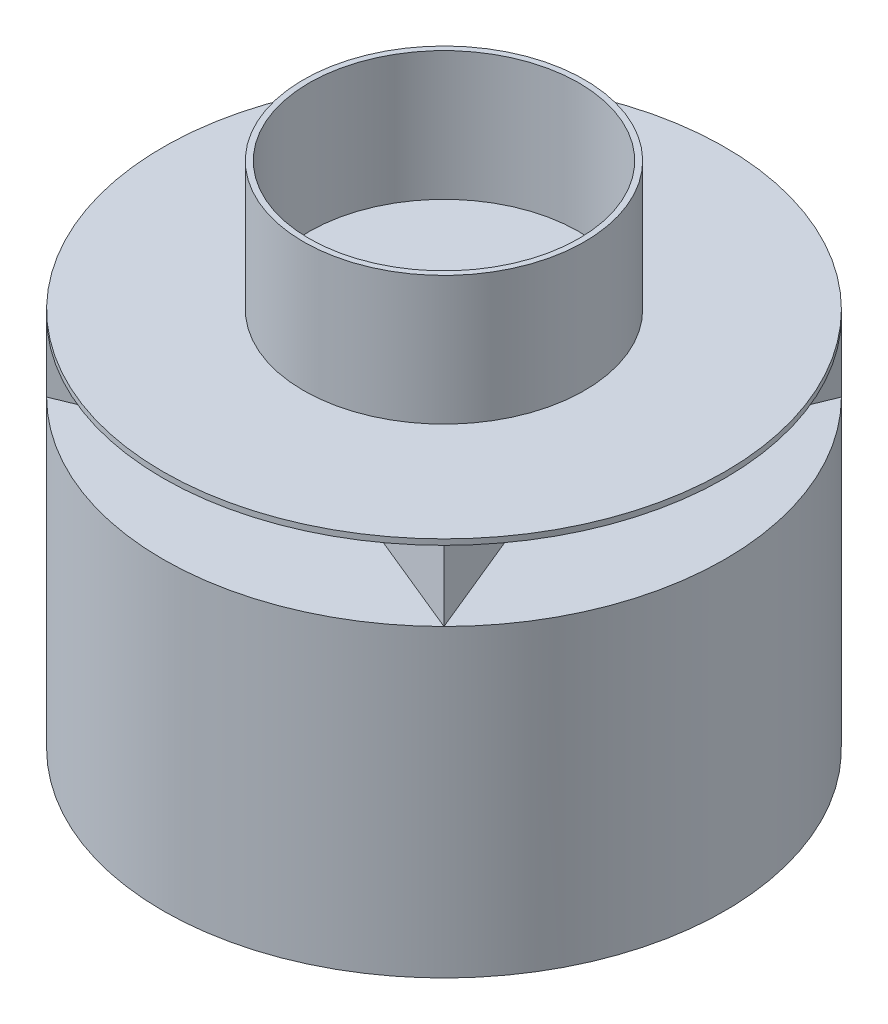
ISO-10303-21;
HEADER;
FILE_DESCRIPTION(('STEP AP214'),'2;1');
FILE_NAME('part.step','',(''),(''),'','','');
FILE_SCHEMA(('AUTOMOTIVE_DESIGN { 1 0 10303 214 1 1 1 1 }'));
ENDSEC;
DATA;
#1=APPLICATION_CONTEXT('core data for automotive mechanical design processes');
#2=APPLICATION_PROTOCOL_DEFINITION('international standard','automotive_design',2000,#1);
#3=PRODUCT_CONTEXT('',#1,'mechanical');
#4=PRODUCT('Part','Part','',(#3));
#5=PRODUCT_RELATED_PRODUCT_CATEGORY('part','',(#4));
#6=PRODUCT_DEFINITION_FORMATION('','',#4);
#7=PRODUCT_DEFINITION_CONTEXT('part definition',#1,'design');
#8=PRODUCT_DEFINITION('design','',#6,#7);
#9=PRODUCT_DEFINITION_SHAPE('','',#8);
#10=(LENGTH_UNIT() NAMED_UNIT(*) SI_UNIT(.MILLI.,.METRE.));
#11=(NAMED_UNIT(*) PLANE_ANGLE_UNIT() SI_UNIT($,.RADIAN.));
#12=(NAMED_UNIT(*) SI_UNIT($,.STERADIAN.) SOLID_ANGLE_UNIT());
#13=UNCERTAINTY_MEASURE_WITH_UNIT(LENGTH_MEASURE(1.E-05),#10,'distance_accuracy_value','');
#14=(GEOMETRIC_REPRESENTATION_CONTEXT(3) GLOBAL_UNCERTAINTY_ASSIGNED_CONTEXT((#13)) GLOBAL_UNIT_ASSIGNED_CONTEXT((#10,
#11,#12)) REPRESENTATION_CONTEXT('',''));
#15=CARTESIAN_POINT('',(0.,0.,0.));
#16=DIRECTION('',(0.,0.,1.));
#17=DIRECTION('',(1.,0.,0.));
#18=AXIS2_PLACEMENT_3D('',#15,#16,#17);
#19=CARTESIAN_POINT('',(0.,330.2,0.));
#20=DIRECTION('',(0.,1.,0.));
#21=DIRECTION('',(0.,0.,1.));
#22=AXIS2_PLACEMENT_3D('',#19,#20,#21);
#23=PLANE('',#22);
#24=CARTESIAN_POINT('',(0.,330.2,0.));
#25=DIRECTION('',(0.,1.,0.));
#26=DIRECTION('',(0.,0.,1.));
#27=AXIS2_PLACEMENT_3D('',#24,#25,#26);
#28=CIRCLE('',#27,304.799999999999);
#29=CARTESIAN_POINT('',(215.526146905657,330.2,215.526146905661));
#30=VERTEX_POINT('',#29);
#31=CARTESIAN_POINT('',(215.526146905657,330.2,-215.526146905661));
#32=VERTEX_POINT('',#31);
#33=EDGE_CURVE('E77',#30,#32,#28,.T.);
#34=ORIENTED_EDGE('',*,*,#33,.T.);
#35=DIRECTION('',(-0.379942648819439,0.,0.925010045139007));
#36=VECTOR('',#35,1.);
#37=CARTESIAN_POINT('',(108.666735118225,330.2,44.6342473753073));
#38=LINE('',#37,#36);
#39=CARTESIAN_POINT('',(127.,330.2,0.));
#40=VERTEX_POINT('',#39);
#41=EDGE_CURVE('E84',#32,#40,#38,.T.);
#42=ORIENTED_EDGE('',*,*,#41,.T.);
#43=DIRECTION('',(0.379942648819439,0.,0.925010045139007));
#44=VECTOR('',#43,1.);
#45=CARTESIAN_POINT('',(127.,330.2,0.));
#46=LINE('',#45,#44);
#47=EDGE_CURVE('E198',#40,#30,#46,.T.);
#48=ORIENTED_EDGE('',*,*,#47,.T.);
#49=EDGE_LOOP('',(#34,#42,#48));
#50=FACE_BOUND('',#49,.T.);
#51=ADVANCED_FACE('F69',(#50),#23,.T.);
#52=DIRECTION('',(0.925010045138999,0.,0.379942648819459));
#53=VECTOR('',#52,1.);
#54=CARTESIAN_POINT('',(0.,330.2,127.));
#55=LINE('',#54,#53);
#56=CARTESIAN_POINT('',(0.,330.2,127.));
#57=VERTEX_POINT('',#56);
#58=EDGE_CURVE('E177',#57,#30,#55,.T.);
#59=ORIENTED_EDGE('',*,*,#58,.F.);
#60=DIRECTION('',(0.925010045138999,0.,-0.379942648819459));
#61=VECTOR('',#60,1.);
#62=CARTESIAN_POINT('',(-215.526146905657,330.2,215.526146905661));
#63=LINE('',#62,#61);
#64=CARTESIAN_POINT('',(-215.526146905657,330.2,215.526146905661));
#65=VERTEX_POINT('',#64);
#66=EDGE_CURVE('E201',#65,#57,#63,.T.);
#67=ORIENTED_EDGE('',*,*,#66,.F.);
#68=EDGE_CURVE('E212',#65,#30,#28,.T.);
#69=ORIENTED_EDGE('',*,*,#68,.T.);
#70=EDGE_LOOP('',(#59,#67,#69));
#71=FACE_BOUND('',#70,.T.);
#72=ADVANCED_FACE('F266',(#71),#23,.T.);
#73=DIRECTION('',(-0.379942648819439,0.,0.925010045139007));
#74=VECTOR('',#73,1.);
#75=CARTESIAN_POINT('',(-127.,330.2,0.));
#76=LINE('',#75,#74);
#77=CARTESIAN_POINT('',(-127.,330.2,0.));
#78=VERTEX_POINT('',#77);
#79=EDGE_CURVE('E203',#78,#65,#76,.T.);
#80=ORIENTED_EDGE('',*,*,#79,.F.);
#81=DIRECTION('',(-0.379942648819439,0.,-0.925010045139007));
#82=VECTOR('',#81,1.);
#83=CARTESIAN_POINT('',(-127.,330.2,0.));
#84=LINE('',#83,#82);
#85=CARTESIAN_POINT('',(-215.526146905657,330.2,-215.526146905661));
#86=VERTEX_POINT('',#85);
#87=EDGE_CURVE('E186',#78,#86,#84,.T.);
#88=ORIENTED_EDGE('',*,*,#87,.T.);
#89=EDGE_CURVE('E218',#86,#65,#28,.T.);
#90=ORIENTED_EDGE('',*,*,#89,.T.);
#91=EDGE_LOOP('',(#80,#88,#90));
#92=FACE_BOUND('',#91,.T.);
#93=ADVANCED_FACE('F273',(#92),#23,.T.);
#94=CARTESIAN_POINT('',(0.,330.2,0.));
#95=DIRECTION('',(0.,-1.,0.));
#96=DIRECTION('',(0.,0.,-1.));
#97=AXIS2_PLACEMENT_3D('',#94,#95,#96);
#98=CYLINDRICAL_SURFACE('',#97,304.799999999999);
#99=ORIENTED_EDGE('',*,*,#33,.F.);
#100=ORIENTED_EDGE('',*,*,#68,.F.);
#101=ORIENTED_EDGE('',*,*,#89,.F.);
#102=EDGE_CURVE('E211',#32,#86,#28,.T.);
#103=ORIENTED_EDGE('',*,*,#102,.F.);
#104=EDGE_LOOP('',(#99,#100,#101,#103));
#105=FACE_BOUND('',#104,.T.);
#106=CARTESIAN_POINT('',(0.,0.,0.));
#107=DIRECTION('',(0.,1.,0.));
#108=DIRECTION('',(0.,0.,1.));
#109=AXIS2_PLACEMENT_3D('',#106,#107,#108);
#110=CIRCLE('',#109,304.799999999999);
#111=CARTESIAN_POINT('',(0.,0.,304.799999999999));
#112=VERTEX_POINT('',#111);
#113=EDGE_CURVE('E213',#112,#112,#110,.T.);
#114=ORIENTED_EDGE('',*,*,#113,.T.);
#115=EDGE_LOOP('',(#114));
#116=FACE_BOUND('',#115,.T.);
#117=ADVANCED_FACE('F71',(#105,#116),#98,.T.);
#118=DIRECTION('',(-0.925010045138999,0.,-0.379942648819459));
#119=VECTOR('',#118,1.);
#120=CARTESIAN_POINT('',(0.,330.2,-127.));
#121=LINE('',#120,#119);
#122=CARTESIAN_POINT('',(0.,330.2,-127.));
#123=VERTEX_POINT('',#122);
#124=EDGE_CURVE('E184',#123,#86,#121,.T.);
#125=ORIENTED_EDGE('',*,*,#124,.F.);
#126=DIRECTION('',(0.925010045138999,0.,-0.379942648819459));
#127=VECTOR('',#126,1.);
#128=CARTESIAN_POINT('',(-44.6342473753093,330.2,-108.666735118223));
#129=LINE('',#128,#127);
#130=EDGE_CURVE('E229',#123,#32,#129,.T.);
#131=ORIENTED_EDGE('',*,*,#130,.T.);
#132=ORIENTED_EDGE('',*,*,#102,.T.);
#133=EDGE_LOOP('',(#125,#131,#132));
#134=FACE_BOUND('',#133,.T.);
#135=ADVANCED_FACE('F269',(#134),#23,.T.);
#136=CARTESIAN_POINT('',(0.,0.,0.));
#137=DIRECTION('',(0.,1.,0.));
#138=DIRECTION('',(0.,0.,1.));
#139=AXIS2_PLACEMENT_3D('',#136,#137,#138);
#140=PLANE('',#139);
#141=ORIENTED_EDGE('',*,*,#113,.F.);
#142=EDGE_LOOP('',(#141));
#143=FACE_BOUND('',#142,.T.);
#144=ADVANCED_FACE('F277',(#143),#140,.F.);
#145=CARTESIAN_POINT('',(108.666735118225,406.4,44.6342473753073));
#146=DIRECTION('',(0.925010045139007,0.,0.379942648819439));
#147=DIRECTION('',(0.379942648819439,0.,-0.925010045139007));
#148=AXIS2_PLACEMENT_3D('',#145,#146,#147);
#149=PLANE('',#148);
#150=ORIENTED_EDGE('',*,*,#41,.F.);
#151=DIRECTION('',(0.,-1.,0.));
#152=VECTOR('',#151,1.);
#153=CARTESIAN_POINT('',(215.526146905657,406.4,-215.526146905661));
#154=LINE('',#153,#152);
#155=CARTESIAN_POINT('',(215.526146905657,406.4,-215.526146905661));
#156=VERTEX_POINT('',#155);
#157=EDGE_CURVE('E222',#156,#32,#154,.T.);
#158=ORIENTED_EDGE('',*,*,#157,.F.);
#159=DIRECTION('',(-0.379942648819439,0.,0.925010045139007));
#160=VECTOR('',#159,1.);
#161=CARTESIAN_POINT('',(108.666735118225,406.4,44.6342473753073));
#162=LINE('',#161,#160);
#163=CARTESIAN_POINT('',(127.,406.4,0.));
#164=VERTEX_POINT('',#163);
#165=EDGE_CURVE('E170',#156,#164,#162,.T.);
#166=ORIENTED_EDGE('',*,*,#165,.T.);
#167=DIRECTION('',(0.,-1.,0.));
#168=VECTOR('',#167,1.);
#169=CARTESIAN_POINT('',(127.,406.4,0.));
#170=LINE('',#169,#168);
#171=EDGE_CURVE('E119',#164,#40,#170,.T.);
#172=ORIENTED_EDGE('',*,*,#171,.T.);
#173=EDGE_LOOP('',(#150,#158,#166,#172));
#174=FACE_BOUND('',#173,.T.);
#175=ADVANCED_FACE('F283',(#174),#149,.T.);
#176=CARTESIAN_POINT('',(-44.6342473753093,406.4,-108.666735118223));
#177=DIRECTION('',(-0.379942648819459,0.,-0.925010045138999));
#178=DIRECTION('',(-0.925010045138999,0.,0.379942648819459));
#179=AXIS2_PLACEMENT_3D('',#176,#177,#178);
#180=PLANE('',#179);
#181=ORIENTED_EDGE('',*,*,#130,.F.);
#182=DIRECTION('',(0.,-1.,0.));
#183=VECTOR('',#182,1.);
#184=CARTESIAN_POINT('',(0.,406.4,-127.));
#185=LINE('',#184,#183);
#186=CARTESIAN_POINT('',(0.,406.4,-127.));
#187=VERTEX_POINT('',#186);
#188=EDGE_CURVE('E226',#187,#123,#185,.T.);
#189=ORIENTED_EDGE('',*,*,#188,.F.);
#190=DIRECTION('',(0.925010045138999,0.,-0.379942648819459));
#191=VECTOR('',#190,1.);
#192=CARTESIAN_POINT('',(-44.6342473753093,406.4,-108.666735118223));
#193=LINE('',#192,#191);
#194=EDGE_CURVE('E228',#187,#156,#193,.T.);
#195=ORIENTED_EDGE('',*,*,#194,.T.);
#196=ORIENTED_EDGE('',*,*,#157,.T.);
#197=EDGE_LOOP('',(#181,#189,#195,#196));
#198=FACE_BOUND('',#197,.T.);
#199=ADVANCED_FACE('F305',(#198),#180,.T.);
#200=CARTESIAN_POINT('',(-127.,406.4,0.));
#201=DIRECTION('',(-0.925010045139007,0.,0.379942648819439));
#202=DIRECTION('',(0.379942648819439,0.,0.925010045139007));
#203=AXIS2_PLACEMENT_3D('',#200,#201,#202);
#204=PLANE('',#203);
#205=ORIENTED_EDGE('',*,*,#87,.F.);
#206=DIRECTION('',(0.,-1.,0.));
#207=VECTOR('',#206,1.);
#208=CARTESIAN_POINT('',(-127.,406.4,0.));
#209=LINE('',#208,#207);
#210=CARTESIAN_POINT('',(-127.,406.4,0.));
#211=VERTEX_POINT('',#210);
#212=EDGE_CURVE('E189',#211,#78,#209,.T.);
#213=ORIENTED_EDGE('',*,*,#212,.F.);
#214=DIRECTION('',(-0.379942648819439,0.,-0.925010045139007));
#215=VECTOR('',#214,1.);
#216=CARTESIAN_POINT('',(-127.,406.4,0.));
#217=LINE('',#216,#215);
#218=CARTESIAN_POINT('',(-215.526146905657,406.4,-215.526146905661));
#219=VERTEX_POINT('',#218);
#220=EDGE_CURVE('E195',#211,#219,#217,.T.);
#221=ORIENTED_EDGE('',*,*,#220,.T.);
#222=DIRECTION('',(0.,-1.,0.));
#223=VECTOR('',#222,1.);
#224=CARTESIAN_POINT('',(-215.526146905657,406.4,-215.526146905661));
#225=LINE('',#224,#223);
#226=EDGE_CURVE('E113',#219,#86,#225,.T.);
#227=ORIENTED_EDGE('',*,*,#226,.T.);
#228=EDGE_LOOP('',(#205,#213,#221,#227));
#229=FACE_BOUND('',#228,.T.);
#230=ADVANCED_FACE('F312',(#229),#204,.T.);
#231=CARTESIAN_POINT('',(0.,406.4,-127.));
#232=DIRECTION('',(-0.379942648819459,0.,0.925010045138999));
#233=DIRECTION('',(0.925010045138999,0.,0.379942648819459));
#234=AXIS2_PLACEMENT_3D('',#231,#232,#233);
#235=PLANE('',#234);
#236=ORIENTED_EDGE('',*,*,#124,.T.);
#237=ORIENTED_EDGE('',*,*,#226,.F.);
#238=DIRECTION('',(-0.925010045138999,0.,-0.379942648819459));
#239=VECTOR('',#238,1.);
#240=CARTESIAN_POINT('',(0.,406.4,-127.));
#241=LINE('',#240,#239);
#242=EDGE_CURVE('E181',#187,#219,#241,.T.);
#243=ORIENTED_EDGE('',*,*,#242,.F.);
#244=ORIENTED_EDGE('',*,*,#188,.T.);
#245=EDGE_LOOP('',(#236,#237,#243,#244));
#246=FACE_BOUND('',#245,.T.);
#247=ADVANCED_FACE('F316',(#246),#235,.F.);
#248=CARTESIAN_POINT('',(0.,406.4,127.));
#249=DIRECTION('',(0.379942648819459,0.,-0.925010045138999));
#250=DIRECTION('',(-0.925010045138999,0.,-0.379942648819459));
#251=AXIS2_PLACEMENT_3D('',#248,#249,#250);
#252=PLANE('',#251);
#253=ORIENTED_EDGE('',*,*,#58,.T.);
#254=DIRECTION('',(0.,-1.,0.));
#255=VECTOR('',#254,1.);
#256=CARTESIAN_POINT('',(215.526146905657,406.4,215.526146905661));
#257=LINE('',#256,#255);
#258=CARTESIAN_POINT('',(215.526146905657,406.4,215.526146905661));
#259=VERTEX_POINT('',#258);
#260=EDGE_CURVE('E174',#259,#30,#257,.T.);
#261=ORIENTED_EDGE('',*,*,#260,.F.);
#262=DIRECTION('',(0.925010045138999,0.,0.379942648819459));
#263=VECTOR('',#262,1.);
#264=CARTESIAN_POINT('',(0.,406.4,127.));
#265=LINE('',#264,#263);
#266=CARTESIAN_POINT('',(0.,406.4,127.));
#267=VERTEX_POINT('',#266);
#268=EDGE_CURVE('E146',#267,#259,#265,.T.);
#269=ORIENTED_EDGE('',*,*,#268,.F.);
#270=DIRECTION('',(0.,-1.,0.));
#271=VECTOR('',#270,1.);
#272=CARTESIAN_POINT('',(0.,406.4,127.));
#273=LINE('',#272,#271);
#274=EDGE_CURVE('E93',#267,#57,#273,.T.);
#275=ORIENTED_EDGE('',*,*,#274,.T.);
#276=EDGE_LOOP('',(#253,#261,#269,#275));
#277=FACE_BOUND('',#276,.T.);
#278=ADVANCED_FACE('F175',(#277),#252,.F.);
#279=CARTESIAN_POINT('',(127.,406.4,0.));
#280=DIRECTION('',(0.925010045139007,0.,-0.379942648819439));
#281=DIRECTION('',(-0.379942648819439,0.,-0.925010045139007));
#282=AXIS2_PLACEMENT_3D('',#279,#280,#281);
#283=PLANE('',#282);
#284=ORIENTED_EDGE('',*,*,#47,.F.);
#285=ORIENTED_EDGE('',*,*,#171,.F.);
#286=DIRECTION('',(0.379942648819439,0.,0.925010045139007));
#287=VECTOR('',#286,1.);
#288=CARTESIAN_POINT('',(127.,406.4,0.));
#289=LINE('',#288,#287);
#290=EDGE_CURVE('E154',#164,#259,#289,.T.);
#291=ORIENTED_EDGE('',*,*,#290,.T.);
#292=ORIENTED_EDGE('',*,*,#260,.T.);
#293=EDGE_LOOP('',(#284,#285,#291,#292));
#294=FACE_BOUND('',#293,.T.);
#295=ADVANCED_FACE('F183',(#294),#283,.T.);
#296=CARTESIAN_POINT('',(-127.,406.4,0.));
#297=DIRECTION('',(0.925010045139007,0.,0.379942648819439));
#298=DIRECTION('',(0.379942648819439,0.,-0.925010045139007));
#299=AXIS2_PLACEMENT_3D('',#296,#297,#298);
#300=PLANE('',#299);
#301=ORIENTED_EDGE('',*,*,#79,.T.);
#302=DIRECTION('',(0.,-1.,0.));
#303=VECTOR('',#302,1.);
#304=CARTESIAN_POINT('',(-215.526146905657,406.4,215.526146905661));
#305=LINE('',#304,#303);
#306=CARTESIAN_POINT('',(-215.526146905657,406.4,215.526146905661));
#307=VERTEX_POINT('',#306);
#308=EDGE_CURVE('E180',#307,#65,#305,.T.);
#309=ORIENTED_EDGE('',*,*,#308,.F.);
#310=DIRECTION('',(-0.379942648819439,0.,0.925010045139007));
#311=VECTOR('',#310,1.);
#312=CARTESIAN_POINT('',(-127.,406.4,0.));
#313=LINE('',#312,#311);
#314=EDGE_CURVE('E193',#211,#307,#313,.T.);
#315=ORIENTED_EDGE('',*,*,#314,.F.);
#316=ORIENTED_EDGE('',*,*,#212,.T.);
#317=EDGE_LOOP('',(#301,#309,#315,#316));
#318=FACE_BOUND('',#317,.T.);
#319=ADVANCED_FACE('F294',(#318),#300,.F.);
#320=CARTESIAN_POINT('',(-215.526146905657,406.4,215.526146905661));
#321=DIRECTION('',(-0.379942648819459,0.,-0.925010045138999));
#322=DIRECTION('',(-0.925010045138999,0.,0.379942648819459));
#323=AXIS2_PLACEMENT_3D('',#320,#321,#322);
#324=PLANE('',#323);
#325=ORIENTED_EDGE('',*,*,#66,.T.);
#326=ORIENTED_EDGE('',*,*,#274,.F.);
#327=DIRECTION('',(0.925010045138999,0.,-0.379942648819459));
#328=VECTOR('',#327,1.);
#329=CARTESIAN_POINT('',(-215.526146905657,406.4,215.526146905661));
#330=LINE('',#329,#328);
#331=EDGE_CURVE('E152',#307,#267,#330,.T.);
#332=ORIENTED_EDGE('',*,*,#331,.F.);
#333=ORIENTED_EDGE('',*,*,#308,.T.);
#334=EDGE_LOOP('',(#325,#326,#332,#333));
#335=FACE_BOUND('',#334,.T.);
#336=ADVANCED_FACE('F297',(#335),#324,.F.);
#337=CARTESIAN_POINT('',(0.,406.4,0.));
#338=DIRECTION('',(0.,1.,0.));
#339=DIRECTION('',(0.,0.,1.));
#340=AXIS2_PLACEMENT_3D('',#337,#338,#339);
#341=PLANE('',#340);
#342=ORIENTED_EDGE('',*,*,#194,.F.);
#343=ORIENTED_EDGE('',*,*,#242,.T.);
#344=CARTESIAN_POINT('',(0.,406.4,0.));
#345=DIRECTION('',(0.,1.,0.));
#346=DIRECTION('',(0.,0.,1.));
#347=AXIS2_PLACEMENT_3D('',#344,#345,#346);
#348=CIRCLE('',#347,304.799999999999);
#349=EDGE_CURVE('E173',#156,#219,#348,.T.);
#350=ORIENTED_EDGE('',*,*,#349,.F.);
#351=EDGE_LOOP('',(#342,#343,#350));
#352=FACE_BOUND('',#351,.T.);
#353=ADVANCED_FACE('F263',(#352),#341,.F.);
#354=ORIENTED_EDGE('',*,*,#220,.F.);
#355=ORIENTED_EDGE('',*,*,#314,.T.);
#356=EDGE_CURVE('E163',#219,#307,#348,.T.);
#357=ORIENTED_EDGE('',*,*,#356,.F.);
#358=EDGE_LOOP('',(#354,#355,#357));
#359=FACE_BOUND('',#358,.T.);
#360=ADVANCED_FACE('F346',(#359),#341,.F.);
#361=ORIENTED_EDGE('',*,*,#290,.F.);
#362=ORIENTED_EDGE('',*,*,#165,.F.);
#363=EDGE_CURVE('E161',#259,#156,#348,.T.);
#364=ORIENTED_EDGE('',*,*,#363,.F.);
#365=EDGE_LOOP('',(#361,#362,#364));
#366=FACE_BOUND('',#365,.T.);
#367=ADVANCED_FACE('F168',(#366),#341,.F.);
#368=CARTESIAN_POINT('',(0.,412.496,0.));
#369=DIRECTION('',(0.,-1.,0.));
#370=DIRECTION('',(0.,0.,-1.));
#371=AXIS2_PLACEMENT_3D('',#368,#369,#370);
#372=CYLINDRICAL_SURFACE('',#371,304.799999999999);
#373=CARTESIAN_POINT('',(0.,412.496,0.));
#374=DIRECTION('',(0.,1.,0.));
#375=DIRECTION('',(0.,0.,1.));
#376=AXIS2_PLACEMENT_3D('',#373,#374,#375);
#377=CIRCLE('',#376,304.799999999999);
#378=CARTESIAN_POINT('',(0.,412.496,304.799999999999));
#379=VERTEX_POINT('',#378);
#380=EDGE_CURVE('E172',#379,#379,#377,.T.);
#381=ORIENTED_EDGE('',*,*,#380,.F.);
#382=EDGE_LOOP('',(#381));
#383=FACE_BOUND('',#382,.T.);
#384=ORIENTED_EDGE('',*,*,#363,.T.);
#385=ORIENTED_EDGE('',*,*,#349,.T.);
#386=ORIENTED_EDGE('',*,*,#356,.T.);
#387=EDGE_CURVE('E149',#307,#259,#348,.T.);
#388=ORIENTED_EDGE('',*,*,#387,.T.);
#389=EDGE_LOOP('',(#384,#385,#386,#388));
#390=FACE_BOUND('',#389,.T.);
#391=ADVANCED_FACE('F159',(#383,#390),#372,.T.);
#392=CARTESIAN_POINT('',(0.,412.496,0.));
#393=DIRECTION('',(0.,1.,0.));
#394=DIRECTION('',(0.,0.,1.));
#395=AXIS2_PLACEMENT_3D('',#392,#393,#394);
#396=PLANE('',#395);
#397=CARTESIAN_POINT('',(0.,412.496,0.));
#398=DIRECTION('',(0.,1.,0.));
#399=DIRECTION('',(0.,0.,1.));
#400=AXIS2_PLACEMENT_3D('',#397,#398,#399);
#401=CIRCLE('',#400,152.4);
#402=CARTESIAN_POINT('',(0.,412.496,152.4));
#403=VERTEX_POINT('',#402);
#404=EDGE_CURVE('E238',#403,#403,#401,.T.);
#405=ORIENTED_EDGE('',*,*,#404,.F.);
#406=EDGE_LOOP('',(#405));
#407=FACE_BOUND('',#406,.T.);
#408=ORIENTED_EDGE('',*,*,#380,.T.);
#409=EDGE_LOOP('',(#408));
#410=FACE_BOUND('',#409,.T.);
#411=ADVANCED_FACE('F261',(#407,#410),#396,.T.);
#412=ORIENTED_EDGE('',*,*,#387,.F.);
#413=ORIENTED_EDGE('',*,*,#331,.T.);
#414=ORIENTED_EDGE('',*,*,#268,.T.);
#415=EDGE_LOOP('',(#412,#413,#414));
#416=FACE_BOUND('',#415,.T.);
#417=ADVANCED_FACE('F148',(#416),#341,.F.);
#418=CARTESIAN_POINT('',(0.,552.196,0.));
#419=DIRECTION('',(0.,1.,0.));
#420=DIRECTION('',(0.,0.,1.));
#421=AXIS2_PLACEMENT_3D('',#418,#419,#420);
#422=PLANE('',#421);
#423=CARTESIAN_POINT('',(0.,552.196,0.));
#424=DIRECTION('',(0.,1.,0.));
#425=DIRECTION('',(0.,0.,1.));
#426=AXIS2_PLACEMENT_3D('',#423,#424,#425);
#427=CIRCLE('',#426,152.4);
#428=CARTESIAN_POINT('',(0.,552.196,152.4));
#429=VERTEX_POINT('',#428);
#430=EDGE_CURVE('E165',#429,#429,#427,.T.);
#431=ORIENTED_EDGE('',*,*,#430,.T.);
#432=EDGE_LOOP('',(#431));
#433=FACE_BOUND('',#432,.T.);
#434=CARTESIAN_POINT('',(0.,552.196,0.));
#435=DIRECTION('',(0.,1.,0.));
#436=DIRECTION('',(0.,0.,1.));
#437=AXIS2_PLACEMENT_3D('',#434,#435,#436);
#438=CIRCLE('',#437,146.304);
#439=CARTESIAN_POINT('',(0.,552.196,146.304));
#440=VERTEX_POINT('',#439);
#441=EDGE_CURVE('E241',#440,#440,#438,.T.);
#442=ORIENTED_EDGE('',*,*,#441,.F.);
#443=EDGE_LOOP('',(#442));
#444=FACE_BOUND('',#443,.T.);
#445=ADVANCED_FACE('F250',(#433,#444),#422,.T.);
#446=CARTESIAN_POINT('',(0.,552.196,0.));
#447=DIRECTION('',(0.,-1.,0.));
#448=DIRECTION('',(0.,0.,-1.));
#449=AXIS2_PLACEMENT_3D('',#446,#447,#448);
#450=CYLINDRICAL_SURFACE('',#449,152.4);
#451=ORIENTED_EDGE('',*,*,#430,.F.);
#452=EDGE_LOOP('',(#451));
#453=FACE_BOUND('',#452,.T.);
#454=ORIENTED_EDGE('',*,*,#404,.T.);
#455=EDGE_LOOP('',(#454));
#456=FACE_BOUND('',#455,.T.);
#457=ADVANCED_FACE('F252',(#453,#456),#450,.T.);
#458=CARTESIAN_POINT('',(0.,552.196,0.));
#459=DIRECTION('',(0.,-1.,0.));
#460=DIRECTION('',(0.,0.,-1.));
#461=AXIS2_PLACEMENT_3D('',#458,#459,#460);
#462=CYLINDRICAL_SURFACE('',#461,146.304);
#463=ORIENTED_EDGE('',*,*,#441,.T.);
#464=EDGE_LOOP('',(#463));
#465=FACE_BOUND('',#464,.T.);
#466=CARTESIAN_POINT('',(0.,412.496,0.));
#467=DIRECTION('',(0.,1.,0.));
#468=DIRECTION('',(0.,0.,1.));
#469=AXIS2_PLACEMENT_3D('',#466,#467,#468);
#470=CIRCLE('',#469,146.304);
#471=CARTESIAN_POINT('',(0.,412.496,146.304));
#472=VERTEX_POINT('',#471);
#473=EDGE_CURVE('E12',#472,#472,#470,.F.);
#474=ORIENTED_EDGE('',*,*,#473,.T.);
#475=EDGE_LOOP('',(#474));
#476=FACE_BOUND('',#475,.T.);
#477=ADVANCED_FACE('F247',(#465,#476),#462,.F.);
#478=ORIENTED_EDGE('',*,*,#473,.F.);
#479=EDGE_LOOP('',(#478));
#480=FACE_BOUND('',#479,.T.);
#481=ADVANCED_FACE('F372',(#480),#396,.T.);
#482=CLOSED_SHELL('',(#51,#72,#93,#117,#135,#144,#175,#199,#230,#247,#278,#295,#319,#336,#353,
#360,#367,#391,#411,#417,#445,#457,#477,#481));
#483=MANIFOLD_SOLID_BREP('B2',#482);
#484=ADVANCED_BREP_SHAPE_REPRESENTATION('',(#18,#483),#14);
#485=SHAPE_DEFINITION_REPRESENTATION(#9,#484);
ENDSEC;
END-ISO-10303-21;
